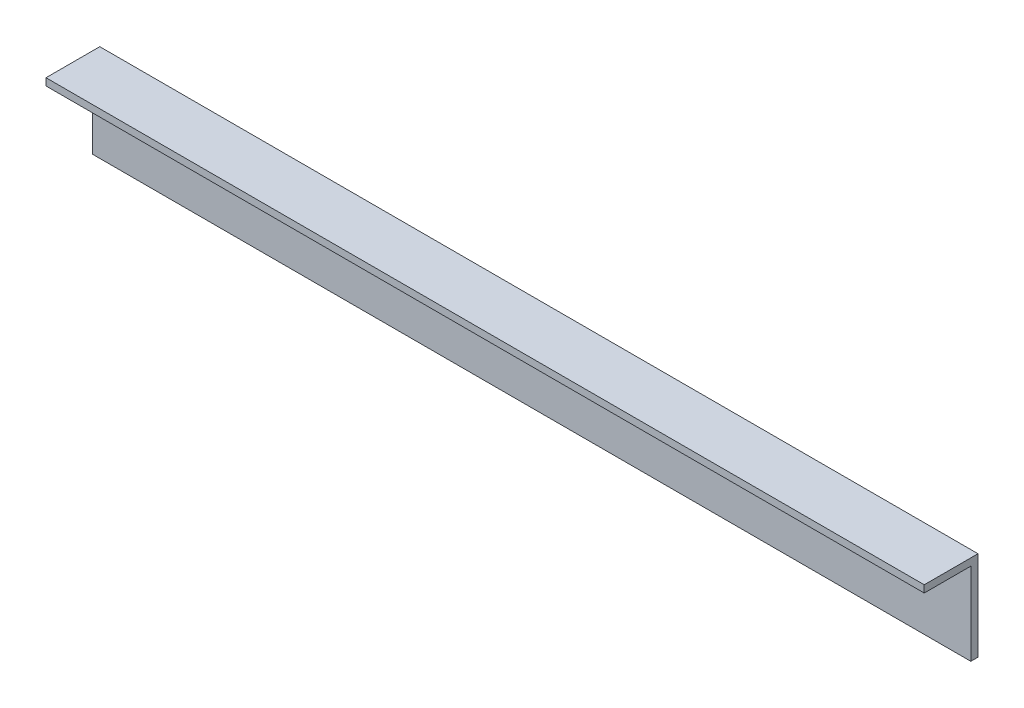
ISO-10303-21;
HEADER;
FILE_DESCRIPTION(('STEP AP214'),'2;1');
FILE_NAME('part.step','',(''),(''),'','','');
FILE_SCHEMA(('AUTOMOTIVE_DESIGN { 1 0 10303 214 1 1 1 1 }'));
ENDSEC;
DATA;
#1=APPLICATION_CONTEXT('core data for automotive mechanical design processes');
#2=APPLICATION_PROTOCOL_DEFINITION('international standard','automotive_design',2000,#1);
#3=PRODUCT_CONTEXT('',#1,'mechanical');
#4=PRODUCT('Part','Part','',(#3));
#5=PRODUCT_RELATED_PRODUCT_CATEGORY('part','',(#4));
#6=PRODUCT_DEFINITION_FORMATION('','',#4);
#7=PRODUCT_DEFINITION_CONTEXT('part definition',#1,'design');
#8=PRODUCT_DEFINITION('design','',#6,#7);
#9=PRODUCT_DEFINITION_SHAPE('','',#8);
#10=(LENGTH_UNIT() NAMED_UNIT(*) SI_UNIT(.MILLI.,.METRE.));
#11=(NAMED_UNIT(*) PLANE_ANGLE_UNIT() SI_UNIT($,.RADIAN.));
#12=(NAMED_UNIT(*) SI_UNIT($,.STERADIAN.) SOLID_ANGLE_UNIT());
#13=UNCERTAINTY_MEASURE_WITH_UNIT(LENGTH_MEASURE(1.E-05),#10,'distance_accuracy_value','');
#14=(GEOMETRIC_REPRESENTATION_CONTEXT(3) GLOBAL_UNCERTAINTY_ASSIGNED_CONTEXT((#13)) GLOBAL_UNIT_ASSIGNED_CONTEXT((#10,
#11,#12)) REPRESENTATION_CONTEXT('',''));
#15=CARTESIAN_POINT('',(0.,0.,0.));
#16=DIRECTION('',(0.,0.,1.));
#17=DIRECTION('',(1.,0.,0.));
#18=AXIS2_PLACEMENT_3D('',#15,#16,#17);
#19=CARTESIAN_POINT('',(-980.,200.,16.));
#20=DIRECTION('',(1.,0.,0.));
#21=DIRECTION('',(0.,0.,-1.));
#22=AXIS2_PLACEMENT_3D('',#19,#20,#21);
#23=PLANE('',#22);
#24=DIRECTION('',(0.,-1.,0.));
#25=VECTOR('',#24,1.);
#26=CARTESIAN_POINT('',(-980.,200.,0.));
#27=LINE('',#26,#25);
#28=CARTESIAN_POINT('',(-980.,200.,0.));
#29=VERTEX_POINT('',#28);
#30=CARTESIAN_POINT('',(-980.,1.11022302462516E-13,0.));
#31=VERTEX_POINT('',#30);
#32=EDGE_CURVE('E92',#29,#31,#27,.T.);
#33=ORIENTED_EDGE('',*,*,#32,.T.);
#34=DIRECTION('',(0.,0.,-1.));
#35=VECTOR('',#34,1.);
#36=CARTESIAN_POINT('',(-980.,1.11022302462516E-13,16.));
#37=LINE('',#36,#35);
#38=CARTESIAN_POINT('',(-980.,1.11022302462516E-13,16.));
#39=VERTEX_POINT('',#38);
#40=EDGE_CURVE('E11',#39,#31,#37,.T.);
#41=ORIENTED_EDGE('',*,*,#40,.F.);
#42=DIRECTION('',(0.,-1.,0.));
#43=VECTOR('',#42,1.);
#44=CARTESIAN_POINT('',(-980.,200.,16.));
#45=LINE('',#44,#43);
#46=CARTESIAN_POINT('',(-980.,184.,16.));
#47=VERTEX_POINT('',#46);
#48=EDGE_CURVE('E85',#47,#39,#45,.T.);
#49=ORIENTED_EDGE('',*,*,#48,.F.);
#50=DIRECTION('',(0.,0.,-1.));
#51=VECTOR('',#50,1.);
#52=CARTESIAN_POINT('',(-980.,184.,120.));
#53=LINE('',#52,#51);
#54=CARTESIAN_POINT('',(-980.,184.,120.));
#55=VERTEX_POINT('',#54);
#56=EDGE_CURVE('E100',#55,#47,#53,.T.);
#57=ORIENTED_EDGE('',*,*,#56,.F.);
#58=DIRECTION('',(0.,-1.,0.));
#59=VECTOR('',#58,1.);
#60=CARTESIAN_POINT('',(-980.,200.,120.));
#61=LINE('',#60,#59);
#62=CARTESIAN_POINT('',(-980.,200.,120.));
#63=VERTEX_POINT('',#62);
#64=EDGE_CURVE('E95',#63,#55,#61,.T.);
#65=ORIENTED_EDGE('',*,*,#64,.F.);
#66=DIRECTION('',(0.,0.,-1.));
#67=VECTOR('',#66,1.);
#68=CARTESIAN_POINT('',(-980.,200.,16.));
#69=LINE('',#68,#67);
#70=EDGE_CURVE('E78',#63,#29,#69,.T.);
#71=ORIENTED_EDGE('',*,*,#70,.T.);
#72=EDGE_LOOP('',(#33,#41,#49,#57,#65,#71));
#73=FACE_BOUND('',#72,.T.);
#74=ADVANCED_FACE('F32',(#73),#23,.F.);
#75=CARTESIAN_POINT('',(-980.,1.11022302462516E-13,16.));
#76=DIRECTION('',(0.,1.,0.));
#77=DIRECTION('',(0.,0.,1.));
#78=AXIS2_PLACEMENT_3D('',#75,#76,#77);
#79=PLANE('',#78);
#80=DIRECTION('',(1.,0.,0.));
#81=VECTOR('',#80,1.);
#82=CARTESIAN_POINT('',(-980.,1.11022302462516E-13,0.));
#83=LINE('',#82,#81);
#84=CARTESIAN_POINT('',(980.,1.11022302462516E-13,0.));
#85=VERTEX_POINT('',#84);
#86=EDGE_CURVE('E99',#31,#85,#83,.T.);
#87=ORIENTED_EDGE('',*,*,#86,.T.);
#88=DIRECTION('',(0.,0.,-1.));
#89=VECTOR('',#88,1.);
#90=CARTESIAN_POINT('',(980.,1.11022302462516E-13,16.));
#91=LINE('',#90,#89);
#92=CARTESIAN_POINT('',(980.,1.11022302462516E-13,16.));
#93=VERTEX_POINT('',#92);
#94=EDGE_CURVE('E40',#93,#85,#91,.T.);
#95=ORIENTED_EDGE('',*,*,#94,.F.);
#96=DIRECTION('',(1.,0.,0.));
#97=VECTOR('',#96,1.);
#98=CARTESIAN_POINT('',(-980.,1.11022302462516E-13,16.));
#99=LINE('',#98,#97);
#100=EDGE_CURVE('E54',#39,#93,#99,.T.);
#101=ORIENTED_EDGE('',*,*,#100,.F.);
#102=ORIENTED_EDGE('',*,*,#40,.T.);
#103=EDGE_LOOP('',(#87,#95,#101,#102));
#104=FACE_BOUND('',#103,.T.);
#105=ADVANCED_FACE('F148',(#104),#79,.F.);
#106=CARTESIAN_POINT('',(980.,200.,16.));
#107=DIRECTION('',(-1.,0.,0.));
#108=DIRECTION('',(0.,0.,1.));
#109=AXIS2_PLACEMENT_3D('',#106,#107,#108);
#110=PLANE('',#109);
#111=DIRECTION('',(0.,1.,0.));
#112=VECTOR('',#111,1.);
#113=CARTESIAN_POINT('',(980.,200.,0.));
#114=LINE('',#113,#112);
#115=CARTESIAN_POINT('',(980.,200.,0.));
#116=VERTEX_POINT('',#115);
#117=EDGE_CURVE('E86',#85,#116,#114,.T.);
#118=ORIENTED_EDGE('',*,*,#117,.T.);
#119=DIRECTION('',(0.,0.,-1.));
#120=VECTOR('',#119,1.);
#121=CARTESIAN_POINT('',(980.,200.,16.));
#122=LINE('',#121,#120);
#123=CARTESIAN_POINT('',(980.,200.,120.));
#124=VERTEX_POINT('',#123);
#125=EDGE_CURVE('E81',#124,#116,#122,.T.);
#126=ORIENTED_EDGE('',*,*,#125,.F.);
#127=DIRECTION('',(0.,1.,0.));
#128=VECTOR('',#127,1.);
#129=CARTESIAN_POINT('',(980.,200.,120.));
#130=LINE('',#129,#128);
#131=CARTESIAN_POINT('',(980.,184.,120.));
#132=VERTEX_POINT('',#131);
#133=EDGE_CURVE('E134',#132,#124,#130,.T.);
#134=ORIENTED_EDGE('',*,*,#133,.F.);
#135=DIRECTION('',(0.,0.,-1.));
#136=VECTOR('',#135,1.);
#137=CARTESIAN_POINT('',(980.,184.,120.));
#138=LINE('',#137,#136);
#139=CARTESIAN_POINT('',(980.,184.,16.));
#140=VERTEX_POINT('',#139);
#141=EDGE_CURVE('E104',#132,#140,#138,.T.);
#142=ORIENTED_EDGE('',*,*,#141,.T.);
#143=DIRECTION('',(0.,1.,0.));
#144=VECTOR('',#143,1.);
#145=CARTESIAN_POINT('',(980.,200.,16.));
#146=LINE('',#145,#144);
#147=EDGE_CURVE('E96',#93,#140,#146,.T.);
#148=ORIENTED_EDGE('',*,*,#147,.F.);
#149=ORIENTED_EDGE('',*,*,#94,.T.);
#150=EDGE_LOOP('',(#118,#126,#134,#142,#148,#149));
#151=FACE_BOUND('',#150,.T.);
#152=ADVANCED_FACE('F132',(#151),#110,.F.);
#153=CARTESIAN_POINT('',(-980.,200.,16.));
#154=DIRECTION('',(0.,-1.,0.));
#155=DIRECTION('',(0.,0.,-1.));
#156=AXIS2_PLACEMENT_3D('',#153,#154,#155);
#157=PLANE('',#156);
#158=DIRECTION('',(-1.,0.,0.));
#159=VECTOR('',#158,1.);
#160=CARTESIAN_POINT('',(-980.,200.,0.));
#161=LINE('',#160,#159);
#162=EDGE_CURVE('E74',#116,#29,#161,.T.);
#163=ORIENTED_EDGE('',*,*,#162,.T.);
#164=ORIENTED_EDGE('',*,*,#70,.F.);
#165=DIRECTION('',(-1.,0.,0.));
#166=VECTOR('',#165,1.);
#167=CARTESIAN_POINT('',(-980.,200.,120.));
#168=LINE('',#167,#166);
#169=EDGE_CURVE('E135',#124,#63,#168,.T.);
#170=ORIENTED_EDGE('',*,*,#169,.F.);
#171=ORIENTED_EDGE('',*,*,#125,.T.);
#172=EDGE_LOOP('',(#163,#164,#170,#171));
#173=FACE_BOUND('',#172,.T.);
#174=ADVANCED_FACE('F76',(#173),#157,.F.);
#175=CARTESIAN_POINT('',(-980.,1.11022302462516E-13,16.));
#176=DIRECTION('',(0.,0.,1.));
#177=DIRECTION('',(1.,0.,0.));
#178=AXIS2_PLACEMENT_3D('',#175,#176,#177);
#179=PLANE('',#178);
#180=DIRECTION('',(1.,0.,0.));
#181=VECTOR('',#180,1.);
#182=CARTESIAN_POINT('',(-980.,184.,16.));
#183=LINE('',#182,#181);
#184=EDGE_CURVE('E48',#47,#140,#183,.T.);
#185=ORIENTED_EDGE('',*,*,#184,.F.);
#186=ORIENTED_EDGE('',*,*,#48,.T.);
#187=ORIENTED_EDGE('',*,*,#100,.T.);
#188=ORIENTED_EDGE('',*,*,#147,.T.);
#189=EDGE_LOOP('',(#185,#186,#187,#188));
#190=FACE_BOUND('',#189,.T.);
#191=ADVANCED_FACE('F122',(#190),#179,.T.);
#192=CARTESIAN_POINT('',(-980.,1.11022302462516E-13,0.));
#193=DIRECTION('',(0.,0.,1.));
#194=DIRECTION('',(1.,0.,0.));
#195=AXIS2_PLACEMENT_3D('',#192,#193,#194);
#196=PLANE('',#195);
#197=ORIENTED_EDGE('',*,*,#32,.F.);
#198=ORIENTED_EDGE('',*,*,#162,.F.);
#199=ORIENTED_EDGE('',*,*,#117,.F.);
#200=ORIENTED_EDGE('',*,*,#86,.F.);
#201=EDGE_LOOP('',(#197,#198,#199,#200));
#202=FACE_BOUND('',#201,.T.);
#203=ADVANCED_FACE('F98',(#202),#196,.F.);
#204=CARTESIAN_POINT('',(-980.,184.,120.));
#205=DIRECTION('',(0.,1.,0.));
#206=DIRECTION('',(0.,0.,1.));
#207=AXIS2_PLACEMENT_3D('',#204,#205,#206);
#208=PLANE('',#207);
#209=ORIENTED_EDGE('',*,*,#184,.T.);
#210=ORIENTED_EDGE('',*,*,#141,.F.);
#211=DIRECTION('',(1.,0.,0.));
#212=VECTOR('',#211,1.);
#213=CARTESIAN_POINT('',(-980.,184.,120.));
#214=LINE('',#213,#212);
#215=EDGE_CURVE('E140',#55,#132,#214,.T.);
#216=ORIENTED_EDGE('',*,*,#215,.F.);
#217=ORIENTED_EDGE('',*,*,#56,.T.);
#218=EDGE_LOOP('',(#209,#210,#216,#217));
#219=FACE_BOUND('',#218,.T.);
#220=ADVANCED_FACE('F128',(#219),#208,.F.);
#221=CARTESIAN_POINT('',(-980.,184.,120.));
#222=DIRECTION('',(0.,0.,1.));
#223=DIRECTION('',(1.,0.,0.));
#224=AXIS2_PLACEMENT_3D('',#221,#222,#223);
#225=PLANE('',#224);
#226=ORIENTED_EDGE('',*,*,#64,.T.);
#227=ORIENTED_EDGE('',*,*,#215,.T.);
#228=ORIENTED_EDGE('',*,*,#133,.T.);
#229=ORIENTED_EDGE('',*,*,#169,.T.);
#230=EDGE_LOOP('',(#226,#227,#228,#229));
#231=FACE_BOUND('',#230,.T.);
#232=ADVANCED_FACE('F145',(#231),#225,.T.);
#233=CLOSED_SHELL('',(#74,#105,#152,#174,#191,#203,#220,#232));
#234=MANIFOLD_SOLID_BREP('B2',#233);
#235=ADVANCED_BREP_SHAPE_REPRESENTATION('',(#18,#234),#14);
#236=SHAPE_DEFINITION_REPRESENTATION(#9,#235);
ENDSEC;
END-ISO-10303-21;
